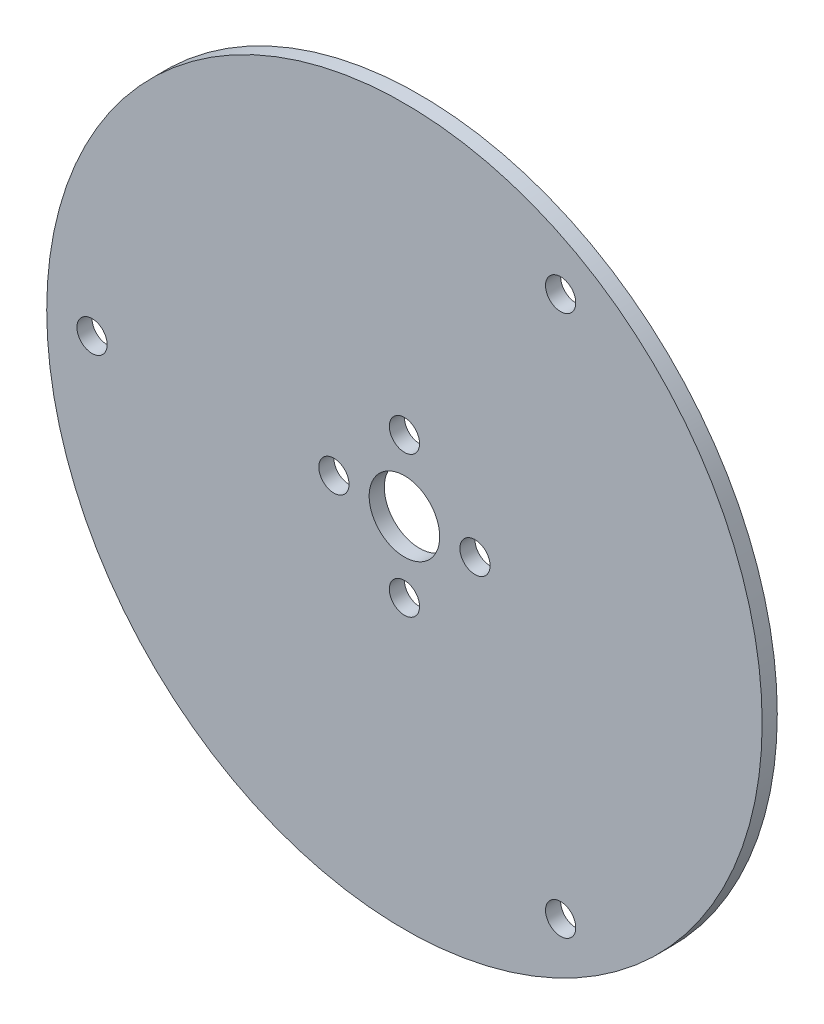
ISO-10303-21;
HEADER;
FILE_DESCRIPTION(('STEP AP214'),'2;1');
FILE_NAME('part.step','',(''),(''),'','','');
FILE_SCHEMA(('AUTOMOTIVE_DESIGN { 1 0 10303 214 1 1 1 1 }'));
ENDSEC;
DATA;
#1=APPLICATION_CONTEXT('core data for automotive mechanical design processes');
#2=APPLICATION_PROTOCOL_DEFINITION('international standard','automotive_design',2000,#1);
#3=PRODUCT_CONTEXT('',#1,'mechanical');
#4=PRODUCT('Part','Part','',(#3));
#5=PRODUCT_RELATED_PRODUCT_CATEGORY('part','',(#4));
#6=PRODUCT_DEFINITION_FORMATION('','',#4);
#7=PRODUCT_DEFINITION_CONTEXT('part definition',#1,'design');
#8=PRODUCT_DEFINITION('design','',#6,#7);
#9=PRODUCT_DEFINITION_SHAPE('','',#8);
#10=(LENGTH_UNIT() NAMED_UNIT(*) SI_UNIT(.MILLI.,.METRE.));
#11=(NAMED_UNIT(*) PLANE_ANGLE_UNIT() SI_UNIT($,.RADIAN.));
#12=(NAMED_UNIT(*) SI_UNIT($,.STERADIAN.) SOLID_ANGLE_UNIT());
#13=UNCERTAINTY_MEASURE_WITH_UNIT(LENGTH_MEASURE(1.E-05),#10,'distance_accuracy_value','');
#14=(GEOMETRIC_REPRESENTATION_CONTEXT(3) GLOBAL_UNCERTAINTY_ASSIGNED_CONTEXT((#13)) GLOBAL_UNIT_ASSIGNED_CONTEXT((#10,
#11,#12)) REPRESENTATION_CONTEXT('',''));
#15=CARTESIAN_POINT('',(0.,0.,0.));
#16=DIRECTION('',(0.,0.,1.));
#17=DIRECTION('',(1.,0.,0.));
#18=AXIS2_PLACEMENT_3D('',#15,#16,#17);
#19=CARTESIAN_POINT('',(0.,0.,1.5));
#20=DIRECTION('',(0.,0.,-1.));
#21=DIRECTION('',(-1.,0.,0.));
#22=AXIS2_PLACEMENT_3D('',#19,#20,#21);
#23=CYLINDRICAL_SURFACE('',#22,35.5);
#24=CARTESIAN_POINT('',(0.,0.,1.5));
#25=DIRECTION('',(0.,0.,1.));
#26=DIRECTION('',(1.,0.,0.));
#27=AXIS2_PLACEMENT_3D('',#24,#25,#26);
#28=CIRCLE('',#27,35.5);
#29=CARTESIAN_POINT('',(35.5,0.,1.5));
#30=VERTEX_POINT('',#29);
#31=EDGE_CURVE('E10',#30,#30,#28,.T.);
#32=ORIENTED_EDGE('',*,*,#31,.F.);
#33=EDGE_LOOP('',(#32));
#34=FACE_BOUND('',#33,.T.);
#35=CARTESIAN_POINT('',(0.,0.,0.));
#36=DIRECTION('',(0.,0.,1.));
#37=DIRECTION('',(1.,0.,0.));
#38=AXIS2_PLACEMENT_3D('',#35,#36,#37);
#39=CIRCLE('',#38,35.5);
#40=CARTESIAN_POINT('',(35.5,0.,0.));
#41=VERTEX_POINT('',#40);
#42=EDGE_CURVE('E45',#41,#41,#39,.T.);
#43=ORIENTED_EDGE('',*,*,#42,.T.);
#44=EDGE_LOOP('',(#43));
#45=FACE_BOUND('',#44,.T.);
#46=ADVANCED_FACE('F37',(#34,#45),#23,.T.);
#47=CARTESIAN_POINT('',(0.,0.,1.5));
#48=DIRECTION('',(0.,0.,1.));
#49=DIRECTION('',(1.,0.,0.));
#50=AXIS2_PLACEMENT_3D('',#47,#48,#49);
#51=PLANE('',#50);
#52=CARTESIAN_POINT('',(-31.,0.,1.5));
#53=DIRECTION('',(0.,0.,1.));
#54=DIRECTION('',(1.,0.,0.));
#55=AXIS2_PLACEMENT_3D('',#52,#53,#54);
#56=CIRCLE('',#55,1.5);
#57=CARTESIAN_POINT('',(-29.5,0.,1.5));
#58=VERTEX_POINT('',#57);
#59=EDGE_CURVE('E81',#58,#58,#56,.T.);
#60=ORIENTED_EDGE('',*,*,#59,.F.);
#61=EDGE_LOOP('',(#60));
#62=FACE_BOUND('',#61,.T.);
#63=CARTESIAN_POINT('',(15.5000000000001,26.8467875173175,1.5));
#64=DIRECTION('',(0.,0.,1.));
#65=DIRECTION('',(1.,0.,0.));
#66=AXIS2_PLACEMENT_3D('',#63,#64,#65);
#67=CIRCLE('',#66,1.5);
#68=CARTESIAN_POINT('',(17.0000000000001,26.8467875173175,1.5));
#69=VERTEX_POINT('',#68);
#70=EDGE_CURVE('E111',#69,#69,#67,.T.);
#71=ORIENTED_EDGE('',*,*,#70,.F.);
#72=EDGE_LOOP('',(#71));
#73=FACE_BOUND('',#72,.T.);
#74=CARTESIAN_POINT('',(15.4999999999998,-26.8467875173177,1.5));
#75=DIRECTION('',(0.,0.,1.));
#76=DIRECTION('',(1.,0.,0.));
#77=AXIS2_PLACEMENT_3D('',#74,#75,#76);
#78=CIRCLE('',#77,1.5);
#79=CARTESIAN_POINT('',(16.9999999999998,-26.8467875173177,1.5));
#80=VERTEX_POINT('',#79);
#81=EDGE_CURVE('E107',#80,#80,#78,.T.);
#82=ORIENTED_EDGE('',*,*,#81,.F.);
#83=EDGE_LOOP('',(#82));
#84=FACE_BOUND('',#83,.T.);
#85=CARTESIAN_POINT('',(0.,7.,1.5));
#86=DIRECTION('',(0.,0.,1.));
#87=DIRECTION('',(1.,0.,0.));
#88=AXIS2_PLACEMENT_3D('',#85,#86,#87);
#89=CIRCLE('',#88,1.5);
#90=CARTESIAN_POINT('',(1.5,7.,1.5));
#91=VERTEX_POINT('',#90);
#92=EDGE_CURVE('E65',#91,#91,#89,.T.);
#93=ORIENTED_EDGE('',*,*,#92,.F.);
#94=EDGE_LOOP('',(#93));
#95=FACE_BOUND('',#94,.T.);
#96=CARTESIAN_POINT('',(7.,0.,1.5));
#97=DIRECTION('',(0.,0.,1.));
#98=DIRECTION('',(1.,0.,0.));
#99=AXIS2_PLACEMENT_3D('',#96,#97,#98);
#100=CIRCLE('',#99,1.5);
#101=CARTESIAN_POINT('',(8.5,0.,1.5));
#102=VERTEX_POINT('',#101);
#103=EDGE_CURVE('E98',#102,#102,#100,.T.);
#104=ORIENTED_EDGE('',*,*,#103,.F.);
#105=EDGE_LOOP('',(#104));
#106=FACE_BOUND('',#105,.T.);
#107=CARTESIAN_POINT('',(1.96380207734619E-13,-7.,1.5));
#108=DIRECTION('',(0.,0.,1.));
#109=DIRECTION('',(1.,0.,0.));
#110=AXIS2_PLACEMENT_3D('',#107,#108,#109);
#111=CIRCLE('',#110,1.50000000000023);
#112=CARTESIAN_POINT('',(1.50000000000043,-7.,1.5));
#113=VERTEX_POINT('',#112);
#114=EDGE_CURVE('E93',#113,#113,#111,.T.);
#115=ORIENTED_EDGE('',*,*,#114,.F.);
#116=EDGE_LOOP('',(#115));
#117=FACE_BOUND('',#116,.T.);
#118=CARTESIAN_POINT('',(-6.9999999999999,0.,1.5));
#119=DIRECTION('',(0.,0.,1.));
#120=DIRECTION('',(1.,0.,0.));
#121=AXIS2_PLACEMENT_3D('',#118,#119,#120);
#122=CIRCLE('',#121,1.50000000000019);
#123=CARTESIAN_POINT('',(-5.49999999999971,0.,1.5));
#124=VERTEX_POINT('',#123);
#125=EDGE_CURVE('E88',#124,#124,#122,.T.);
#126=ORIENTED_EDGE('',*,*,#125,.F.);
#127=EDGE_LOOP('',(#126));
#128=FACE_BOUND('',#127,.T.);
#129=CARTESIAN_POINT('',(0.,0.,1.5));
#130=DIRECTION('',(0.,0.,1.));
#131=DIRECTION('',(1.,0.,0.));
#132=AXIS2_PLACEMENT_3D('',#129,#130,#131);
#133=CIRCLE('',#132,3.5);
#134=CARTESIAN_POINT('',(3.5,0.,1.5));
#135=VERTEX_POINT('',#134);
#136=EDGE_CURVE('E54',#135,#135,#133,.T.);
#137=ORIENTED_EDGE('',*,*,#136,.F.);
#138=EDGE_LOOP('',(#137));
#139=FACE_BOUND('',#138,.T.);
#140=ORIENTED_EDGE('',*,*,#31,.T.);
#141=EDGE_LOOP('',(#140));
#142=FACE_BOUND('',#141,.T.);
#143=ADVANCED_FACE('F122',(#62,#73,#84,#95,#106,#117,#128,#139,#142),#51,.T.);
#144=CARTESIAN_POINT('',(0.,0.,0.));
#145=DIRECTION('',(0.,0.,1.));
#146=DIRECTION('',(1.,0.,0.));
#147=AXIS2_PLACEMENT_3D('',#144,#145,#146);
#148=PLANE('',#147);
#149=CARTESIAN_POINT('',(-31.,0.,0.));
#150=DIRECTION('',(0.,0.,1.));
#151=DIRECTION('',(1.,0.,0.));
#152=AXIS2_PLACEMENT_3D('',#149,#150,#151);
#153=CIRCLE('',#152,1.5);
#154=CARTESIAN_POINT('',(-29.5,0.,0.));
#155=VERTEX_POINT('',#154);
#156=EDGE_CURVE('E40',#155,#155,#153,.T.);
#157=ORIENTED_EDGE('',*,*,#156,.T.);
#158=EDGE_LOOP('',(#157));
#159=FACE_BOUND('',#158,.T.);
#160=CARTESIAN_POINT('',(15.5000000000001,26.8467875173175,0.));
#161=DIRECTION('',(0.,0.,1.));
#162=DIRECTION('',(1.,0.,0.));
#163=AXIS2_PLACEMENT_3D('',#160,#161,#162);
#164=CIRCLE('',#163,1.5);
#165=CARTESIAN_POINT('',(17.0000000000001,26.8467875173175,0.));
#166=VERTEX_POINT('',#165);
#167=EDGE_CURVE('E80',#166,#166,#164,.T.);
#168=ORIENTED_EDGE('',*,*,#167,.T.);
#169=EDGE_LOOP('',(#168));
#170=FACE_BOUND('',#169,.T.);
#171=CARTESIAN_POINT('',(15.4999999999998,-26.8467875173177,0.));
#172=DIRECTION('',(0.,0.,1.));
#173=DIRECTION('',(1.,0.,0.));
#174=AXIS2_PLACEMENT_3D('',#171,#172,#173);
#175=CIRCLE('',#174,1.5);
#176=CARTESIAN_POINT('',(16.9999999999998,-26.8467875173177,0.));
#177=VERTEX_POINT('',#176);
#178=EDGE_CURVE('E77',#177,#177,#175,.T.);
#179=ORIENTED_EDGE('',*,*,#178,.T.);
#180=EDGE_LOOP('',(#179));
#181=FACE_BOUND('',#180,.T.);
#182=CARTESIAN_POINT('',(0.,7.,0.));
#183=DIRECTION('',(0.,0.,1.));
#184=DIRECTION('',(1.,0.,0.));
#185=AXIS2_PLACEMENT_3D('',#182,#183,#184);
#186=CIRCLE('',#185,1.5);
#187=CARTESIAN_POINT('',(1.5,7.,0.));
#188=VERTEX_POINT('',#187);
#189=EDGE_CURVE('E73',#188,#188,#186,.T.);
#190=ORIENTED_EDGE('',*,*,#189,.T.);
#191=EDGE_LOOP('',(#190));
#192=FACE_BOUND('',#191,.T.);
#193=CARTESIAN_POINT('',(7.,0.,0.));
#194=DIRECTION('',(0.,0.,1.));
#195=DIRECTION('',(1.,0.,0.));
#196=AXIS2_PLACEMENT_3D('',#193,#194,#195);
#197=CIRCLE('',#196,1.5);
#198=CARTESIAN_POINT('',(8.5,0.,0.));
#199=VERTEX_POINT('',#198);
#200=EDGE_CURVE('E69',#199,#199,#197,.T.);
#201=ORIENTED_EDGE('',*,*,#200,.T.);
#202=EDGE_LOOP('',(#201));
#203=FACE_BOUND('',#202,.T.);
#204=CARTESIAN_POINT('',(1.96380207734619E-13,-7.,0.));
#205=DIRECTION('',(0.,0.,1.));
#206=DIRECTION('',(1.,0.,0.));
#207=AXIS2_PLACEMENT_3D('',#204,#205,#206);
#208=CIRCLE('',#207,1.50000000000023);
#209=CARTESIAN_POINT('',(1.50000000000043,-7.,0.));
#210=VERTEX_POINT('',#209);
#211=EDGE_CURVE('E64',#210,#210,#208,.T.);
#212=ORIENTED_EDGE('',*,*,#211,.T.);
#213=EDGE_LOOP('',(#212));
#214=FACE_BOUND('',#213,.T.);
#215=CARTESIAN_POINT('',(-6.9999999999999,0.,0.));
#216=DIRECTION('',(0.,0.,1.));
#217=DIRECTION('',(1.,0.,0.));
#218=AXIS2_PLACEMENT_3D('',#215,#216,#217);
#219=CIRCLE('',#218,1.50000000000019);
#220=CARTESIAN_POINT('',(-5.49999999999971,0.,0.));
#221=VERTEX_POINT('',#220);
#222=EDGE_CURVE('E60',#221,#221,#219,.T.);
#223=ORIENTED_EDGE('',*,*,#222,.T.);
#224=EDGE_LOOP('',(#223));
#225=FACE_BOUND('',#224,.T.);
#226=CARTESIAN_POINT('',(0.,0.,0.));
#227=DIRECTION('',(0.,0.,1.));
#228=DIRECTION('',(1.,0.,0.));
#229=AXIS2_PLACEMENT_3D('',#226,#227,#228);
#230=CIRCLE('',#229,3.5);
#231=CARTESIAN_POINT('',(3.5,0.,0.));
#232=VERTEX_POINT('',#231);
#233=EDGE_CURVE('E51',#232,#232,#230,.T.);
#234=ORIENTED_EDGE('',*,*,#233,.T.);
#235=EDGE_LOOP('',(#234));
#236=FACE_BOUND('',#235,.T.);
#237=ORIENTED_EDGE('',*,*,#42,.F.);
#238=EDGE_LOOP('',(#237));
#239=FACE_BOUND('',#238,.T.);
#240=ADVANCED_FACE('F125',(#159,#170,#181,#192,#203,#214,#225,#236,#239),#148,.F.);
#241=CARTESIAN_POINT('',(0.,0.,-0.5));
#242=DIRECTION('',(0.,0.,1.));
#243=DIRECTION('',(1.,0.,0.));
#244=AXIS2_PLACEMENT_3D('',#241,#242,#243);
#245=CYLINDRICAL_SURFACE('',#244,3.5);
#246=ORIENTED_EDGE('',*,*,#136,.T.);
#247=EDGE_LOOP('',(#246));
#248=FACE_BOUND('',#247,.T.);
#249=ORIENTED_EDGE('',*,*,#233,.F.);
#250=EDGE_LOOP('',(#249));
#251=FACE_BOUND('',#250,.T.);
#252=ADVANCED_FACE('F142',(#248,#251),#245,.F.);
#253=CARTESIAN_POINT('',(-6.9999999999999,0.,-0.5));
#254=DIRECTION('',(0.,0.,1.));
#255=DIRECTION('',(1.,0.,0.));
#256=AXIS2_PLACEMENT_3D('',#253,#254,#255);
#257=CYLINDRICAL_SURFACE('',#256,1.50000000000019);
#258=ORIENTED_EDGE('',*,*,#125,.T.);
#259=EDGE_LOOP('',(#258));
#260=FACE_BOUND('',#259,.T.);
#261=ORIENTED_EDGE('',*,*,#222,.F.);
#262=EDGE_LOOP('',(#261));
#263=FACE_BOUND('',#262,.T.);
#264=ADVANCED_FACE('F145',(#260,#263),#257,.F.);
#265=CARTESIAN_POINT('',(1.96380207734619E-13,-7.,-0.5));
#266=DIRECTION('',(0.,0.,1.));
#267=DIRECTION('',(1.,0.,0.));
#268=AXIS2_PLACEMENT_3D('',#265,#266,#267);
#269=CYLINDRICAL_SURFACE('',#268,1.50000000000023);
#270=ORIENTED_EDGE('',*,*,#114,.T.);
#271=EDGE_LOOP('',(#270));
#272=FACE_BOUND('',#271,.T.);
#273=ORIENTED_EDGE('',*,*,#211,.F.);
#274=EDGE_LOOP('',(#273));
#275=FACE_BOUND('',#274,.T.);
#276=ADVANCED_FACE('F177',(#272,#275),#269,.F.);
#277=CARTESIAN_POINT('',(7.,0.,-0.5));
#278=DIRECTION('',(0.,0.,1.));
#279=DIRECTION('',(1.,0.,0.));
#280=AXIS2_PLACEMENT_3D('',#277,#278,#279);
#281=CYLINDRICAL_SURFACE('',#280,1.5);
#282=ORIENTED_EDGE('',*,*,#103,.T.);
#283=EDGE_LOOP('',(#282));
#284=FACE_BOUND('',#283,.T.);
#285=ORIENTED_EDGE('',*,*,#200,.F.);
#286=EDGE_LOOP('',(#285));
#287=FACE_BOUND('',#286,.T.);
#288=ADVANCED_FACE('F184',(#284,#287),#281,.F.);
#289=CARTESIAN_POINT('',(0.,7.,-0.5));
#290=DIRECTION('',(0.,0.,1.));
#291=DIRECTION('',(1.,0.,0.));
#292=AXIS2_PLACEMENT_3D('',#289,#290,#291);
#293=CYLINDRICAL_SURFACE('',#292,1.5);
#294=ORIENTED_EDGE('',*,*,#92,.T.);
#295=EDGE_LOOP('',(#294));
#296=FACE_BOUND('',#295,.T.);
#297=ORIENTED_EDGE('',*,*,#189,.F.);
#298=EDGE_LOOP('',(#297));
#299=FACE_BOUND('',#298,.T.);
#300=ADVANCED_FACE('F192',(#296,#299),#293,.F.);
#301=CARTESIAN_POINT('',(15.4999999999998,-26.8467875173177,-0.5));
#302=DIRECTION('',(0.,0.,1.));
#303=DIRECTION('',(1.,0.,0.));
#304=AXIS2_PLACEMENT_3D('',#301,#302,#303);
#305=CYLINDRICAL_SURFACE('',#304,1.5);
#306=ORIENTED_EDGE('',*,*,#81,.T.);
#307=EDGE_LOOP('',(#306));
#308=FACE_BOUND('',#307,.T.);
#309=ORIENTED_EDGE('',*,*,#178,.F.);
#310=EDGE_LOOP('',(#309));
#311=FACE_BOUND('',#310,.T.);
#312=ADVANCED_FACE('F199',(#308,#311),#305,.F.);
#313=CARTESIAN_POINT('',(15.5000000000001,26.8467875173175,-0.5));
#314=DIRECTION('',(0.,0.,1.));
#315=DIRECTION('',(1.,0.,0.));
#316=AXIS2_PLACEMENT_3D('',#313,#314,#315);
#317=CYLINDRICAL_SURFACE('',#316,1.5);
#318=ORIENTED_EDGE('',*,*,#70,.T.);
#319=EDGE_LOOP('',(#318));
#320=FACE_BOUND('',#319,.T.);
#321=ORIENTED_EDGE('',*,*,#167,.F.);
#322=EDGE_LOOP('',(#321));
#323=FACE_BOUND('',#322,.T.);
#324=ADVANCED_FACE('F206',(#320,#323),#317,.F.);
#325=CARTESIAN_POINT('',(-31.,0.,-0.5));
#326=DIRECTION('',(0.,0.,1.));
#327=DIRECTION('',(1.,0.,0.));
#328=AXIS2_PLACEMENT_3D('',#325,#326,#327);
#329=CYLINDRICAL_SURFACE('',#328,1.5);
#330=ORIENTED_EDGE('',*,*,#59,.T.);
#331=EDGE_LOOP('',(#330));
#332=FACE_BOUND('',#331,.T.);
#333=ORIENTED_EDGE('',*,*,#156,.F.);
#334=EDGE_LOOP('',(#333));
#335=FACE_BOUND('',#334,.T.);
#336=ADVANCED_FACE('F119',(#332,#335),#329,.F.);
#337=CLOSED_SHELL('',(#46,#143,#240,#252,#264,#276,#288,#300,#312,#324,#336));
#338=MANIFOLD_SOLID_BREP('B2',#337);
#339=ADVANCED_BREP_SHAPE_REPRESENTATION('',(#18,#338),#14);
#340=SHAPE_DEFINITION_REPRESENTATION(#9,#339);
ENDSEC;
END-ISO-10303-21;
